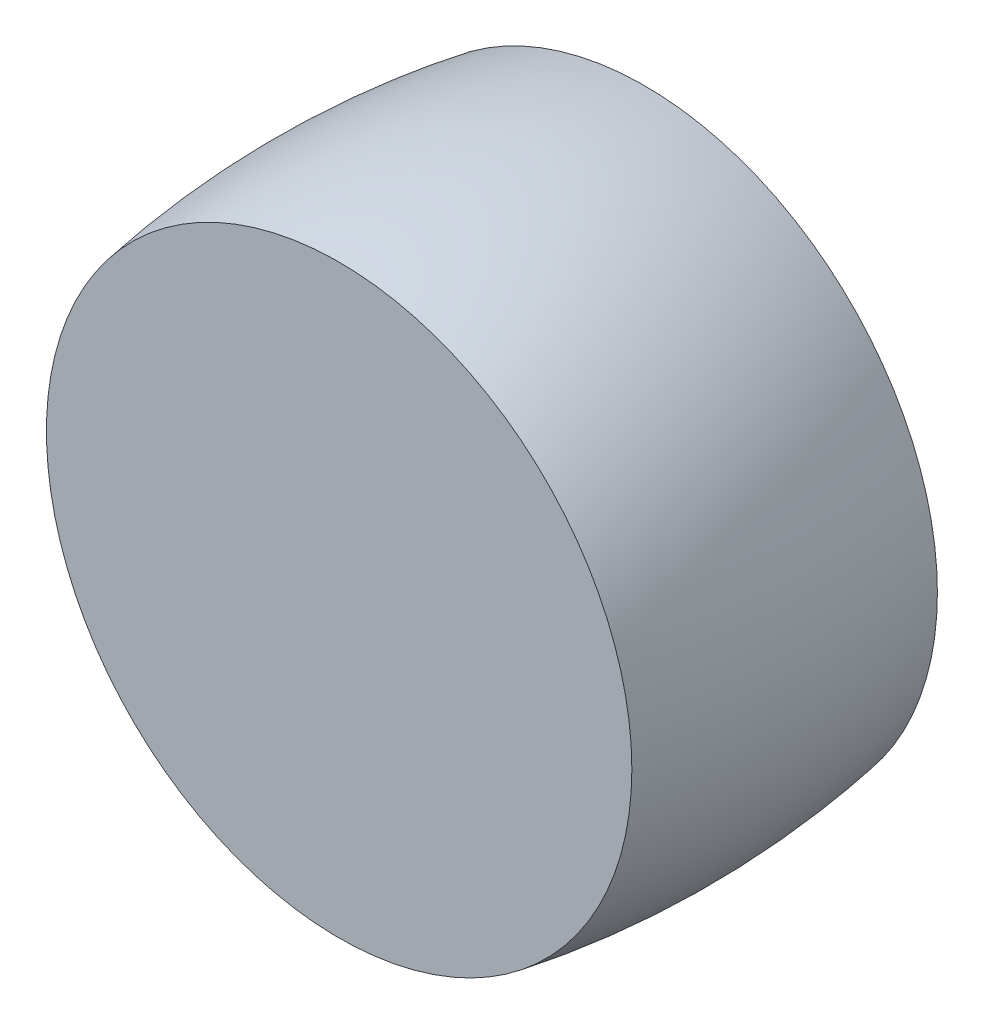
ISO-10303-21;
HEADER;
FILE_DESCRIPTION(('STEP AP214'),'2;1');
FILE_NAME('part.step','',(''),(''),'','','');
FILE_SCHEMA(('AUTOMOTIVE_DESIGN { 1 0 10303 214 1 1 1 1 }'));
ENDSEC;
DATA;
#1=APPLICATION_CONTEXT('core data for automotive mechanical design processes');
#2=APPLICATION_PROTOCOL_DEFINITION('international standard','automotive_design',2000,#1);
#3=PRODUCT_CONTEXT('',#1,'mechanical');
#4=PRODUCT('Part','Part','',(#3));
#5=PRODUCT_RELATED_PRODUCT_CATEGORY('part','',(#4));
#6=PRODUCT_DEFINITION_FORMATION('','',#4);
#7=PRODUCT_DEFINITION_CONTEXT('part definition',#1,'design');
#8=PRODUCT_DEFINITION('design','',#6,#7);
#9=PRODUCT_DEFINITION_SHAPE('','',#8);
#10=(LENGTH_UNIT() NAMED_UNIT(*) SI_UNIT(.MILLI.,.METRE.));
#11=(NAMED_UNIT(*) PLANE_ANGLE_UNIT() SI_UNIT($,.RADIAN.));
#12=(NAMED_UNIT(*) SI_UNIT($,.STERADIAN.) SOLID_ANGLE_UNIT());
#13=UNCERTAINTY_MEASURE_WITH_UNIT(LENGTH_MEASURE(1.E-05),#10,'distance_accuracy_value','');
#14=(GEOMETRIC_REPRESENTATION_CONTEXT(3) GLOBAL_UNCERTAINTY_ASSIGNED_CONTEXT((#13)) GLOBAL_UNIT_ASSIGNED_CONTEXT((#10,
#11,#12)) REPRESENTATION_CONTEXT('',''));
#15=CARTESIAN_POINT('',(0.,0.,0.));
#16=DIRECTION('',(0.,0.,1.));
#17=DIRECTION('',(1.,0.,0.));
#18=AXIS2_PLACEMENT_3D('',#15,#16,#17);
#19=CARTESIAN_POINT('',(0.,0.,20.));
#20=DIRECTION('',(0.,0.,1.));
#21=DIRECTION('',(1.,0.,0.));
#22=AXIS2_PLACEMENT_3D('',#19,#20,#21);
#23=PLANE('',#22);
#24=CARTESIAN_POINT('',(0.,0.,20.));
#25=DIRECTION('',(0.,0.,1.));
#26=DIRECTION('',(1.,0.,0.));
#27=AXIS2_PLACEMENT_3D('',#24,#25,#26);
#28=CIRCLE('',#27,38.3215958139904);
#29=CARTESIAN_POINT('',(38.3215958139904,0.,20.));
#30=VERTEX_POINT('',#29);
#31=EDGE_CURVE('E10',#30,#30,#28,.T.);
#32=ORIENTED_EDGE('',*,*,#31,.T.);
#33=EDGE_LOOP('',(#32));
#34=FACE_BOUND('',#33,.T.);
#35=ADVANCED_FACE('F41',(#34),#23,.T.);
#36=CARTESIAN_POINT('',(0.,0.,8.99232695250607E-07));
#37=DIRECTION('',(0.,0.,1.));
#38=DIRECTION('',(1.,0.,0.));
#39=AXIS2_PLACEMENT_3D('',#36,#37,#38);
#40=DEGENERATE_TOROIDAL_SURFACE('',#39,80.,120.,.F.);
#41=CARTESIAN_POINT('',(0.,0.,-20.));
#42=DIRECTION('',(0.,0.,1.));
#43=DIRECTION('',(1.,0.,0.));
#44=AXIS2_PLACEMENT_3D('',#41,#42,#43);
#45=CIRCLE('',#44,38.3215955099943);
#46=CARTESIAN_POINT('',(38.3215955099943,0.,-20.));
#47=VERTEX_POINT('',#46);
#48=EDGE_CURVE('E48',#47,#47,#45,.T.);
#49=ORIENTED_EDGE('',*,*,#48,.T.);
#50=EDGE_LOOP('',(#49));
#51=FACE_BOUND('',#50,.T.);
#52=ORIENTED_EDGE('',*,*,#31,.F.);
#53=EDGE_LOOP('',(#52));
#54=FACE_BOUND('',#53,.T.);
#55=ADVANCED_FACE('F55',(#51,#54),#40,.F.);
#56=CARTESIAN_POINT('',(0.,0.,-20.));
#57=DIRECTION('',(0.,0.,-1.));
#58=DIRECTION('',(-1.,0.,0.));
#59=AXIS2_PLACEMENT_3D('',#56,#57,#58);
#60=PLANE('',#59);
#61=ORIENTED_EDGE('',*,*,#48,.F.);
#62=EDGE_LOOP('',(#61));
#63=FACE_BOUND('',#62,.T.);
#64=ADVANCED_FACE('F58',(#63),#60,.T.);
#65=CLOSED_SHELL('',(#35,#55,#64));
#66=MANIFOLD_SOLID_BREP('B2',#65);
#67=ADVANCED_BREP_SHAPE_REPRESENTATION('',(#18,#66),#14);
#68=SHAPE_DEFINITION_REPRESENTATION(#9,#67);
ENDSEC;
END-ISO-10303-21;
